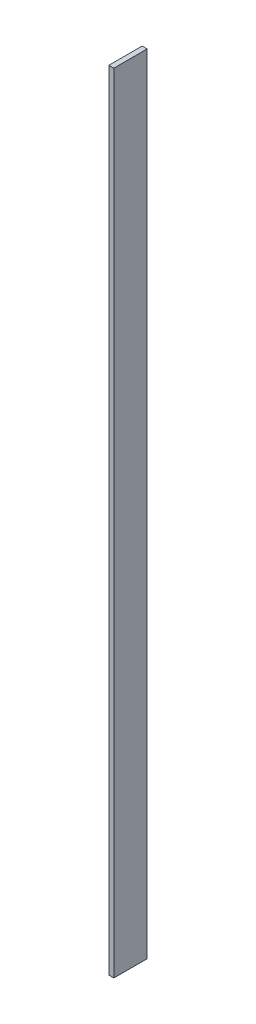
ISO-10303-21;
HEADER;
FILE_DESCRIPTION(('STEP AP214'),'2;1');
FILE_NAME('part.step','',(''),(''),'','','');
FILE_SCHEMA(('AUTOMOTIVE_DESIGN { 1 0 10303 214 1 1 1 1 }'));
ENDSEC;
DATA;
#1=APPLICATION_CONTEXT('core data for automotive mechanical design processes');
#2=APPLICATION_PROTOCOL_DEFINITION('international standard','automotive_design',2000,#1);
#3=PRODUCT_CONTEXT('',#1,'mechanical');
#4=PRODUCT('Part','Part','',(#3));
#5=PRODUCT_RELATED_PRODUCT_CATEGORY('part','',(#4));
#6=PRODUCT_DEFINITION_FORMATION('','',#4);
#7=PRODUCT_DEFINITION_CONTEXT('part definition',#1,'design');
#8=PRODUCT_DEFINITION('design','',#6,#7);
#9=PRODUCT_DEFINITION_SHAPE('','',#8);
#10=(LENGTH_UNIT() NAMED_UNIT(*) SI_UNIT(.MILLI.,.METRE.));
#11=(NAMED_UNIT(*) PLANE_ANGLE_UNIT() SI_UNIT($,.RADIAN.));
#12=(NAMED_UNIT(*) SI_UNIT($,.STERADIAN.) SOLID_ANGLE_UNIT());
#13=UNCERTAINTY_MEASURE_WITH_UNIT(LENGTH_MEASURE(1.E-05),#10,'distance_accuracy_value','');
#14=(GEOMETRIC_REPRESENTATION_CONTEXT(3) GLOBAL_UNCERTAINTY_ASSIGNED_CONTEXT((#13)) GLOBAL_UNIT_ASSIGNED_CONTEXT((#10,
#11,#12)) REPRESENTATION_CONTEXT('',''));
#15=CARTESIAN_POINT('',(0.,0.,0.));
#16=DIRECTION('',(0.,0.,1.));
#17=DIRECTION('',(1.,0.,0.));
#18=AXIS2_PLACEMENT_3D('',#15,#16,#17);
#19=CARTESIAN_POINT('',(2.38125,0.,0.));
#20=DIRECTION('',(0.,0.,-1.));
#21=DIRECTION('',(-1.,0.,0.));
#22=AXIS2_PLACEMENT_3D('',#19,#20,#21);
#23=PLANE('',#22);
#24=DIRECTION('',(0.,-1.,0.));
#25=VECTOR('',#24,1.);
#26=CARTESIAN_POINT('',(0.,0.,0.));
#27=LINE('',#26,#25);
#28=CARTESIAN_POINT('',(0.,374.65,0.));
#29=VERTEX_POINT('',#28);
#30=CARTESIAN_POINT('',(0.,0.,0.));
#31=VERTEX_POINT('',#30);
#32=EDGE_CURVE('E104',#29,#31,#27,.T.);
#33=ORIENTED_EDGE('',*,*,#32,.T.);
#34=DIRECTION('',(-1.,0.,0.));
#35=VECTOR('',#34,1.);
#36=CARTESIAN_POINT('',(2.38125,0.,0.));
#37=LINE('',#36,#35);
#38=CARTESIAN_POINT('',(2.38125,0.,0.));
#39=VERTEX_POINT('',#38);
#40=EDGE_CURVE('E11',#39,#31,#37,.T.);
#41=ORIENTED_EDGE('',*,*,#40,.F.);
#42=DIRECTION('',(0.,-1.,0.));
#43=VECTOR('',#42,1.);
#44=CARTESIAN_POINT('',(2.38125,0.,0.));
#45=LINE('',#44,#43);
#46=CARTESIAN_POINT('',(2.38125,374.65,0.));
#47=VERTEX_POINT('',#46);
#48=EDGE_CURVE('E92',#47,#39,#45,.T.);
#49=ORIENTED_EDGE('',*,*,#48,.F.);
#50=DIRECTION('',(-1.,0.,0.));
#51=VECTOR('',#50,1.);
#52=CARTESIAN_POINT('',(2.38125,374.65,0.));
#53=LINE('',#52,#51);
#54=EDGE_CURVE('E100',#47,#29,#53,.T.);
#55=ORIENTED_EDGE('',*,*,#54,.T.);
#56=EDGE_LOOP('',(#33,#41,#49,#55));
#57=FACE_BOUND('',#56,.T.);
#58=ADVANCED_FACE('F41',(#57),#23,.F.);
#59=CARTESIAN_POINT('',(2.38125,0.,0.));
#60=DIRECTION('',(0.,1.,0.));
#61=DIRECTION('',(0.,0.,1.));
#62=AXIS2_PLACEMENT_3D('',#59,#60,#61);
#63=PLANE('',#62);
#64=DIRECTION('',(0.,0.,-1.));
#65=VECTOR('',#64,1.);
#66=CARTESIAN_POINT('',(0.,0.,0.));
#67=LINE('',#66,#65);
#68=CARTESIAN_POINT('',(0.,0.,-15.875));
#69=VERTEX_POINT('',#68);
#70=EDGE_CURVE('E96',#31,#69,#67,.T.);
#71=ORIENTED_EDGE('',*,*,#70,.T.);
#72=DIRECTION('',(-1.,0.,0.));
#73=VECTOR('',#72,1.);
#74=CARTESIAN_POINT('',(2.38125,0.,-15.875));
#75=LINE('',#74,#73);
#76=CARTESIAN_POINT('',(2.38125,0.,-15.875));
#77=VERTEX_POINT('',#76);
#78=EDGE_CURVE('E49',#77,#69,#75,.T.);
#79=ORIENTED_EDGE('',*,*,#78,.F.);
#80=DIRECTION('',(0.,0.,-1.));
#81=VECTOR('',#80,1.);
#82=CARTESIAN_POINT('',(2.38125,0.,0.));
#83=LINE('',#82,#81);
#84=EDGE_CURVE('E87',#39,#77,#83,.T.);
#85=ORIENTED_EDGE('',*,*,#84,.F.);
#86=ORIENTED_EDGE('',*,*,#40,.T.);
#87=EDGE_LOOP('',(#71,#79,#85,#86));
#88=FACE_BOUND('',#87,.T.);
#89=ADVANCED_FACE('F95',(#88),#63,.F.);
#90=CARTESIAN_POINT('',(2.38125,0.,-15.875));
#91=DIRECTION('',(0.,0.,1.));
#92=DIRECTION('',(1.,0.,0.));
#93=AXIS2_PLACEMENT_3D('',#90,#91,#92);
#94=PLANE('',#93);
#95=DIRECTION('',(0.,1.,0.));
#96=VECTOR('',#95,1.);
#97=CARTESIAN_POINT('',(0.,0.,-15.875));
#98=LINE('',#97,#96);
#99=CARTESIAN_POINT('',(0.,374.65,-15.875));
#100=VERTEX_POINT('',#99);
#101=EDGE_CURVE('E74',#69,#100,#98,.T.);
#102=ORIENTED_EDGE('',*,*,#101,.T.);
#103=DIRECTION('',(-1.,0.,0.));
#104=VECTOR('',#103,1.);
#105=CARTESIAN_POINT('',(2.38125,374.65,-15.875));
#106=LINE('',#105,#104);
#107=CARTESIAN_POINT('',(2.38125,374.65,-15.875));
#108=VERTEX_POINT('',#107);
#109=EDGE_CURVE('E97',#108,#100,#106,.T.);
#110=ORIENTED_EDGE('',*,*,#109,.F.);
#111=DIRECTION('',(0.,1.,0.));
#112=VECTOR('',#111,1.);
#113=CARTESIAN_POINT('',(2.38125,0.,-15.875));
#114=LINE('',#113,#112);
#115=EDGE_CURVE('E90',#77,#108,#114,.T.);
#116=ORIENTED_EDGE('',*,*,#115,.F.);
#117=ORIENTED_EDGE('',*,*,#78,.T.);
#118=EDGE_LOOP('',(#102,#110,#116,#117));
#119=FACE_BOUND('',#118,.T.);
#120=ADVANCED_FACE('F98',(#119),#94,.F.);
#121=CARTESIAN_POINT('',(2.38125,374.65,0.));
#122=DIRECTION('',(0.,-1.,0.));
#123=DIRECTION('',(0.,0.,-1.));
#124=AXIS2_PLACEMENT_3D('',#121,#122,#123);
#125=PLANE('',#124);
#126=DIRECTION('',(0.,0.,1.));
#127=VECTOR('',#126,1.);
#128=CARTESIAN_POINT('',(0.,374.65,0.));
#129=LINE('',#128,#127);
#130=EDGE_CURVE('E80',#100,#29,#129,.T.);
#131=ORIENTED_EDGE('',*,*,#130,.T.);
#132=ORIENTED_EDGE('',*,*,#54,.F.);
#133=DIRECTION('',(0.,0.,1.));
#134=VECTOR('',#133,1.);
#135=CARTESIAN_POINT('',(2.38125,374.65,0.));
#136=LINE('',#135,#134);
#137=EDGE_CURVE('E57',#108,#47,#136,.T.);
#138=ORIENTED_EDGE('',*,*,#137,.F.);
#139=ORIENTED_EDGE('',*,*,#109,.T.);
#140=EDGE_LOOP('',(#131,#132,#138,#139));
#141=FACE_BOUND('',#140,.T.);
#142=ADVANCED_FACE('F111',(#141),#125,.F.);
#143=CARTESIAN_POINT('',(2.38125,0.,0.));
#144=DIRECTION('',(-1.,0.,0.));
#145=DIRECTION('',(0.,0.,1.));
#146=AXIS2_PLACEMENT_3D('',#143,#144,#145);
#147=PLANE('',#146);
#148=ORIENTED_EDGE('',*,*,#48,.T.);
#149=ORIENTED_EDGE('',*,*,#84,.T.);
#150=ORIENTED_EDGE('',*,*,#115,.T.);
#151=ORIENTED_EDGE('',*,*,#137,.T.);
#152=EDGE_LOOP('',(#148,#149,#150,#151));
#153=FACE_BOUND('',#152,.T.);
#154=ADVANCED_FACE('F88',(#153),#147,.F.);
#155=CARTESIAN_POINT('',(0.,0.,0.));
#156=DIRECTION('',(-1.,0.,0.));
#157=DIRECTION('',(0.,0.,1.));
#158=AXIS2_PLACEMENT_3D('',#155,#156,#157);
#159=PLANE('',#158);
#160=ORIENTED_EDGE('',*,*,#32,.F.);
#161=ORIENTED_EDGE('',*,*,#130,.F.);
#162=ORIENTED_EDGE('',*,*,#101,.F.);
#163=ORIENTED_EDGE('',*,*,#70,.F.);
#164=EDGE_LOOP('',(#160,#161,#162,#163));
#165=FACE_BOUND('',#164,.T.);
#166=ADVANCED_FACE('F114',(#165),#159,.T.);
#167=CLOSED_SHELL('',(#58,#89,#120,#142,#154,#166));
#168=MANIFOLD_SOLID_BREP('B2',#167);
#169=ADVANCED_BREP_SHAPE_REPRESENTATION('',(#18,#168),#14);
#170=SHAPE_DEFINITION_REPRESENTATION(#9,#169);
ENDSEC;
END-ISO-10303-21;
